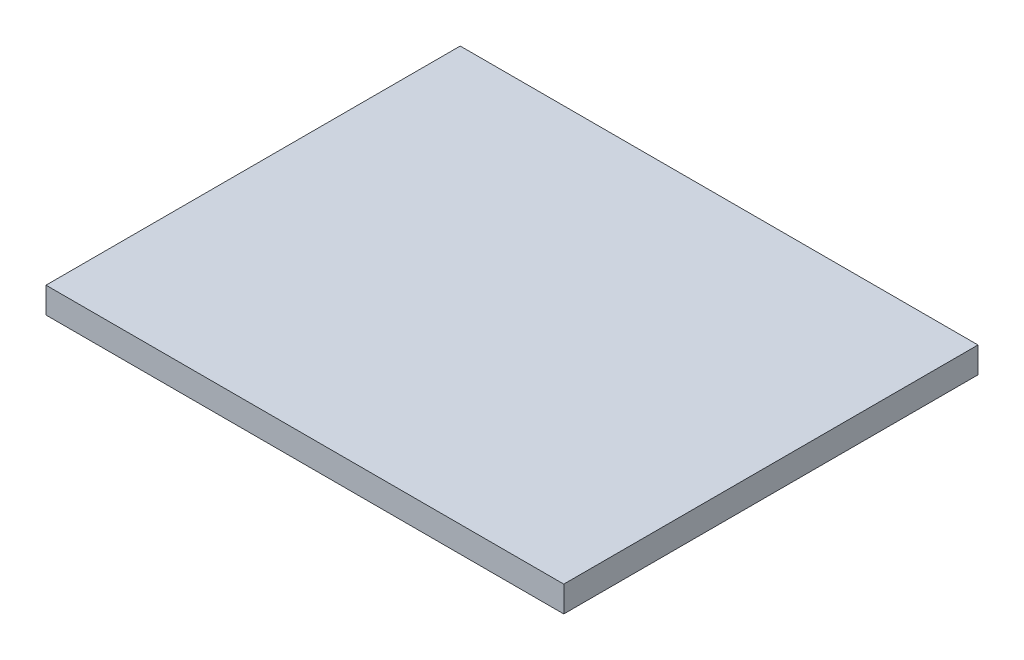
ISO-10303-21;
HEADER;
FILE_DESCRIPTION(('STEP AP214'),'2;1');
FILE_NAME('part.step','',(''),(''),'','','');
FILE_SCHEMA(('AUTOMOTIVE_DESIGN { 1 0 10303 214 1 1 1 1 }'));
ENDSEC;
DATA;
#1=APPLICATION_CONTEXT('core data for automotive mechanical design processes');
#2=APPLICATION_PROTOCOL_DEFINITION('international standard','automotive_design',2000,#1);
#3=PRODUCT_CONTEXT('',#1,'mechanical');
#4=PRODUCT('Part','Part','',(#3));
#5=PRODUCT_RELATED_PRODUCT_CATEGORY('part','',(#4));
#6=PRODUCT_DEFINITION_FORMATION('','',#4);
#7=PRODUCT_DEFINITION_CONTEXT('part definition',#1,'design');
#8=PRODUCT_DEFINITION('design','',#6,#7);
#9=PRODUCT_DEFINITION_SHAPE('','',#8);
#10=(LENGTH_UNIT() NAMED_UNIT(*) SI_UNIT(.MILLI.,.METRE.));
#11=(NAMED_UNIT(*) PLANE_ANGLE_UNIT() SI_UNIT($,.RADIAN.));
#12=(NAMED_UNIT(*) SI_UNIT($,.STERADIAN.) SOLID_ANGLE_UNIT());
#13=UNCERTAINTY_MEASURE_WITH_UNIT(LENGTH_MEASURE(1.E-05),#10,'distance_accuracy_value','');
#14=(GEOMETRIC_REPRESENTATION_CONTEXT(3) GLOBAL_UNCERTAINTY_ASSIGNED_CONTEXT((#13)) GLOBAL_UNIT_ASSIGNED_CONTEXT((#10,
#11,#12)) REPRESENTATION_CONTEXT('',''));
#15=CARTESIAN_POINT('',(0.,0.,0.));
#16=DIRECTION('',(0.,0.,1.));
#17=DIRECTION('',(1.,0.,0.));
#18=AXIS2_PLACEMENT_3D('',#15,#16,#17);
#19=CARTESIAN_POINT('',(0.,5.,0.));
#20=DIRECTION('',(1.,0.,0.));
#21=DIRECTION('',(0.,0.,-1.));
#22=AXIS2_PLACEMENT_3D('',#19,#20,#21);
#23=PLANE('',#22);
#24=DIRECTION('',(0.,0.,1.));
#25=VECTOR('',#24,1.);
#26=CARTESIAN_POINT('',(0.,0.,0.));
#27=LINE('',#26,#25);
#28=CARTESIAN_POINT('',(0.,0.,-80.));
#29=VERTEX_POINT('',#28);
#30=CARTESIAN_POINT('',(0.,0.,0.));
#31=VERTEX_POINT('',#30);
#32=EDGE_CURVE('E111',#29,#31,#27,.T.);
#33=ORIENTED_EDGE('',*,*,#32,.T.);
#34=DIRECTION('',(0.,-1.,0.));
#35=VECTOR('',#34,1.);
#36=CARTESIAN_POINT('',(0.,5.,0.));
#37=LINE('',#36,#35);
#38=CARTESIAN_POINT('',(0.,5.,0.));
#39=VERTEX_POINT('',#38);
#40=EDGE_CURVE('E11',#39,#31,#37,.T.);
#41=ORIENTED_EDGE('',*,*,#40,.F.);
#42=DIRECTION('',(0.,0.,1.));
#43=VECTOR('',#42,1.);
#44=CARTESIAN_POINT('',(0.,5.,0.));
#45=LINE('',#44,#43);
#46=CARTESIAN_POINT('',(0.,5.,-80.));
#47=VERTEX_POINT('',#46);
#48=EDGE_CURVE('E95',#47,#39,#45,.T.);
#49=ORIENTED_EDGE('',*,*,#48,.F.);
#50=DIRECTION('',(0.,-1.,0.));
#51=VECTOR('',#50,1.);
#52=CARTESIAN_POINT('',(0.,5.,-80.));
#53=LINE('',#52,#51);
#54=EDGE_CURVE('E107',#47,#29,#53,.T.);
#55=ORIENTED_EDGE('',*,*,#54,.T.);
#56=EDGE_LOOP('',(#33,#41,#49,#55));
#57=FACE_BOUND('',#56,.T.);
#58=ADVANCED_FACE('F43',(#57),#23,.F.);
#59=CARTESIAN_POINT('',(0.,5.,0.));
#60=DIRECTION('',(0.,0.,-1.));
#61=DIRECTION('',(-1.,0.,0.));
#62=AXIS2_PLACEMENT_3D('',#59,#60,#61);
#63=PLANE('',#62);
#64=DIRECTION('',(1.,0.,0.));
#65=VECTOR('',#64,1.);
#66=CARTESIAN_POINT('',(0.,0.,0.));
#67=LINE('',#66,#65);
#68=CARTESIAN_POINT('',(100.,0.,0.));
#69=VERTEX_POINT('',#68);
#70=EDGE_CURVE('E100',#31,#69,#67,.T.);
#71=ORIENTED_EDGE('',*,*,#70,.T.);
#72=DIRECTION('',(0.,-1.,0.));
#73=VECTOR('',#72,1.);
#74=CARTESIAN_POINT('',(100.,5.,0.));
#75=LINE('',#74,#73);
#76=CARTESIAN_POINT('',(100.,5.,0.));
#77=VERTEX_POINT('',#76);
#78=EDGE_CURVE('E52',#77,#69,#75,.T.);
#79=ORIENTED_EDGE('',*,*,#78,.F.);
#80=DIRECTION('',(1.,0.,0.));
#81=VECTOR('',#80,1.);
#82=CARTESIAN_POINT('',(0.,5.,0.));
#83=LINE('',#82,#81);
#84=EDGE_CURVE('E90',#39,#77,#83,.T.);
#85=ORIENTED_EDGE('',*,*,#84,.F.);
#86=ORIENTED_EDGE('',*,*,#40,.T.);
#87=EDGE_LOOP('',(#71,#79,#85,#86));
#88=FACE_BOUND('',#87,.T.);
#89=ADVANCED_FACE('F99',(#88),#63,.F.);
#90=CARTESIAN_POINT('',(100.,5.,0.));
#91=DIRECTION('',(-1.,0.,0.));
#92=DIRECTION('',(0.,0.,1.));
#93=AXIS2_PLACEMENT_3D('',#90,#91,#92);
#94=PLANE('',#93);
#95=DIRECTION('',(0.,0.,-1.));
#96=VECTOR('',#95,1.);
#97=CARTESIAN_POINT('',(100.,0.,0.));
#98=LINE('',#97,#96);
#99=CARTESIAN_POINT('',(100.,0.,-80.));
#100=VERTEX_POINT('',#99);
#101=EDGE_CURVE('E77',#69,#100,#98,.T.);
#102=ORIENTED_EDGE('',*,*,#101,.T.);
#103=DIRECTION('',(0.,-1.,0.));
#104=VECTOR('',#103,1.);
#105=CARTESIAN_POINT('',(100.,5.,-80.));
#106=LINE('',#105,#104);
#107=CARTESIAN_POINT('',(100.,5.,-80.));
#108=VERTEX_POINT('',#107);
#109=EDGE_CURVE('E102',#108,#100,#106,.T.);
#110=ORIENTED_EDGE('',*,*,#109,.F.);
#111=DIRECTION('',(0.,0.,-1.));
#112=VECTOR('',#111,1.);
#113=CARTESIAN_POINT('',(100.,5.,0.));
#114=LINE('',#113,#112);
#115=EDGE_CURVE('E93',#77,#108,#114,.T.);
#116=ORIENTED_EDGE('',*,*,#115,.F.);
#117=ORIENTED_EDGE('',*,*,#78,.T.);
#118=EDGE_LOOP('',(#102,#110,#116,#117));
#119=FACE_BOUND('',#118,.T.);
#120=ADVANCED_FACE('F103',(#119),#94,.F.);
#121=CARTESIAN_POINT('',(0.,5.,-80.));
#122=DIRECTION('',(0.,0.,1.));
#123=DIRECTION('',(1.,0.,0.));
#124=AXIS2_PLACEMENT_3D('',#121,#122,#123);
#125=PLANE('',#124);
#126=DIRECTION('',(-1.,0.,0.));
#127=VECTOR('',#126,1.);
#128=CARTESIAN_POINT('',(0.,0.,-80.));
#129=LINE('',#128,#127);
#130=EDGE_CURVE('E83',#100,#29,#129,.T.);
#131=ORIENTED_EDGE('',*,*,#130,.T.);
#132=ORIENTED_EDGE('',*,*,#54,.F.);
#133=DIRECTION('',(-1.,0.,0.));
#134=VECTOR('',#133,1.);
#135=CARTESIAN_POINT('',(0.,5.,-80.));
#136=LINE('',#135,#134);
#137=EDGE_CURVE('E60',#108,#47,#136,.T.);
#138=ORIENTED_EDGE('',*,*,#137,.F.);
#139=ORIENTED_EDGE('',*,*,#109,.T.);
#140=EDGE_LOOP('',(#131,#132,#138,#139));
#141=FACE_BOUND('',#140,.T.);
#142=ADVANCED_FACE('F124',(#141),#125,.F.);
#143=CARTESIAN_POINT('',(0.,5.,0.));
#144=DIRECTION('',(0.,-1.,0.));
#145=DIRECTION('',(0.,0.,-1.));
#146=AXIS2_PLACEMENT_3D('',#143,#144,#145);
#147=PLANE('',#146);
#148=ORIENTED_EDGE('',*,*,#48,.T.);
#149=ORIENTED_EDGE('',*,*,#84,.T.);
#150=ORIENTED_EDGE('',*,*,#115,.T.);
#151=ORIENTED_EDGE('',*,*,#137,.T.);
#152=EDGE_LOOP('',(#148,#149,#150,#151));
#153=FACE_BOUND('',#152,.T.);
#154=ADVANCED_FACE('F91',(#153),#147,.F.);
#155=CARTESIAN_POINT('',(0.,0.,0.));
#156=DIRECTION('',(0.,-1.,0.));
#157=DIRECTION('',(0.,0.,-1.));
#158=AXIS2_PLACEMENT_3D('',#155,#156,#157);
#159=PLANE('',#158);
#160=ORIENTED_EDGE('',*,*,#32,.F.);
#161=ORIENTED_EDGE('',*,*,#130,.F.);
#162=ORIENTED_EDGE('',*,*,#101,.F.);
#163=ORIENTED_EDGE('',*,*,#70,.F.);
#164=EDGE_LOOP('',(#160,#161,#162,#163));
#165=FACE_BOUND('',#164,.T.);
#166=ADVANCED_FACE('F127',(#165),#159,.T.);
#167=CLOSED_SHELL('',(#58,#89,#120,#142,#154,#166));
#168=MANIFOLD_SOLID_BREP('B2',#167);
#169=ADVANCED_BREP_SHAPE_REPRESENTATION('',(#18,#168),#14);
#170=SHAPE_DEFINITION_REPRESENTATION(#9,#169);
ENDSEC;
END-ISO-10303-21;
